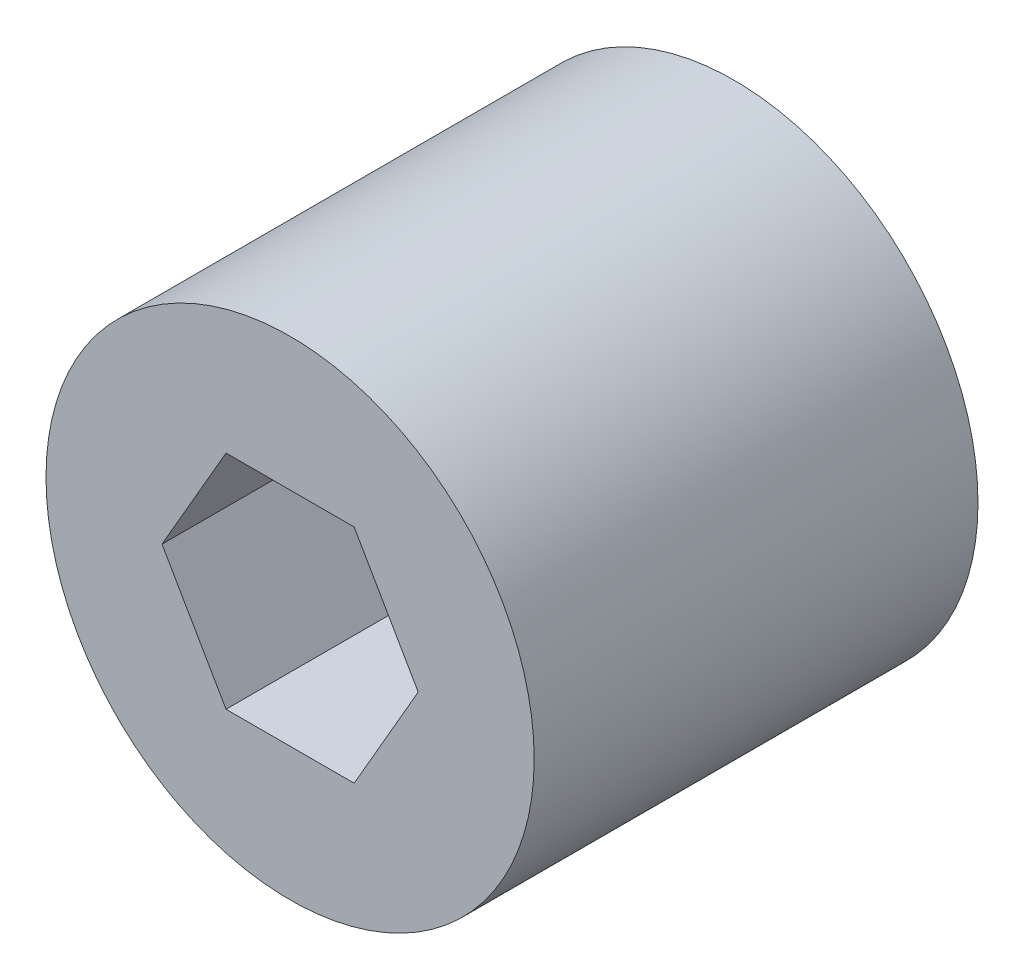
ISO-10303-21;
HEADER;
FILE_DESCRIPTION(('STEP AP214'),'2;1');
FILE_NAME('part.step','',(''),(''),'','','');
FILE_SCHEMA(('AUTOMOTIVE_DESIGN { 1 0 10303 214 1 1 1 1 }'));
ENDSEC;
DATA;
#1=APPLICATION_CONTEXT('core data for automotive mechanical design processes');
#2=APPLICATION_PROTOCOL_DEFINITION('international standard','automotive_design',2000,#1);
#3=PRODUCT_CONTEXT('',#1,'mechanical');
#4=PRODUCT('Part','Part','',(#3));
#5=PRODUCT_RELATED_PRODUCT_CATEGORY('part','',(#4));
#6=PRODUCT_DEFINITION_FORMATION('','',#4);
#7=PRODUCT_DEFINITION_CONTEXT('part definition',#1,'design');
#8=PRODUCT_DEFINITION('design','',#6,#7);
#9=PRODUCT_DEFINITION_SHAPE('','',#8);
#10=(LENGTH_UNIT() NAMED_UNIT(*) SI_UNIT(.MILLI.,.METRE.));
#11=(NAMED_UNIT(*) PLANE_ANGLE_UNIT() SI_UNIT($,.RADIAN.));
#12=(NAMED_UNIT(*) SI_UNIT($,.STERADIAN.) SOLID_ANGLE_UNIT());
#13=UNCERTAINTY_MEASURE_WITH_UNIT(LENGTH_MEASURE(1.E-05),#10,'distance_accuracy_value','');
#14=(GEOMETRIC_REPRESENTATION_CONTEXT(3) GLOBAL_UNCERTAINTY_ASSIGNED_CONTEXT((#13)) GLOBAL_UNIT_ASSIGNED_CONTEXT((#10,
#11,#12)) REPRESENTATION_CONTEXT('',''));
#15=CARTESIAN_POINT('',(0.,0.,0.));
#16=DIRECTION('',(0.,0.,1.));
#17=DIRECTION('',(1.,0.,0.));
#18=AXIS2_PLACEMENT_3D('',#15,#16,#17);
#19=CARTESIAN_POINT('',(0.,0.,-25.4));
#20=DIRECTION('',(0.,0.,1.));
#21=DIRECTION('',(1.,0.,0.));
#22=AXIS2_PLACEMENT_3D('',#19,#20,#21);
#23=CYLINDRICAL_SURFACE('',#22,13.97);
#24=CARTESIAN_POINT('',(0.,0.,-25.4));
#25=DIRECTION('',(0.,0.,1.));
#26=DIRECTION('',(1.,0.,0.));
#27=AXIS2_PLACEMENT_3D('',#24,#25,#26);
#28=CIRCLE('',#27,13.97);
#29=CARTESIAN_POINT('',(13.97,0.,-25.4));
#30=VERTEX_POINT('',#29);
#31=EDGE_CURVE('E11',#30,#30,#28,.T.);
#32=ORIENTED_EDGE('',*,*,#31,.T.);
#33=EDGE_LOOP('',(#32));
#34=FACE_BOUND('',#33,.T.);
#35=CARTESIAN_POINT('',(0.,0.,0.));
#36=DIRECTION('',(0.,0.,1.));
#37=DIRECTION('',(1.,0.,0.));
#38=AXIS2_PLACEMENT_3D('',#35,#36,#37);
#39=CIRCLE('',#38,13.97);
#40=CARTESIAN_POINT('',(13.97,0.,0.));
#41=VERTEX_POINT('',#40);
#42=EDGE_CURVE('E42',#41,#41,#39,.T.);
#43=ORIENTED_EDGE('',*,*,#42,.F.);
#44=EDGE_LOOP('',(#43));
#45=FACE_BOUND('',#44,.T.);
#46=ADVANCED_FACE('F39',(#34,#45),#23,.T.);
#47=CARTESIAN_POINT('',(0.,0.,-25.4));
#48=DIRECTION('',(0.,0.,1.));
#49=DIRECTION('',(1.,0.,0.));
#50=AXIS2_PLACEMENT_3D('',#47,#48,#49);
#51=PLANE('',#50);
#52=DIRECTION('',(-0.5,0.866025403784438,0.));
#53=VECTOR('',#52,1.);
#54=CARTESIAN_POINT('',(7.33234841870825,0.,-25.4));
#55=LINE('',#54,#53);
#56=CARTESIAN_POINT('',(7.33234841870825,0.,-25.4));
#57=VERTEX_POINT('',#56);
#58=CARTESIAN_POINT('',(3.66617420935412,6.35,-25.4));
#59=VERTEX_POINT('',#58);
#60=EDGE_CURVE('E101',#57,#59,#55,.T.);
#61=ORIENTED_EDGE('',*,*,#60,.T.);
#62=DIRECTION('',(-1.,0.,0.));
#63=VECTOR('',#62,1.);
#64=CARTESIAN_POINT('',(3.66617420935412,6.35,-25.4));
#65=LINE('',#64,#63);
#66=CARTESIAN_POINT('',(-3.66617420935413,6.35,-25.4));
#67=VERTEX_POINT('',#66);
#68=EDGE_CURVE('E94',#59,#67,#65,.T.);
#69=ORIENTED_EDGE('',*,*,#68,.T.);
#70=DIRECTION('',(-0.5,-0.866025403784439,0.));
#71=VECTOR('',#70,1.);
#72=CARTESIAN_POINT('',(-3.66617420935413,6.35,-25.4));
#73=LINE('',#72,#71);
#74=CARTESIAN_POINT('',(-7.33234841870825,0.,-25.4));
#75=VERTEX_POINT('',#74);
#76=EDGE_CURVE('E104',#67,#75,#73,.T.);
#77=ORIENTED_EDGE('',*,*,#76,.T.);
#78=DIRECTION('',(0.5,-0.866025403784438,0.));
#79=VECTOR('',#78,1.);
#80=CARTESIAN_POINT('',(-7.33234841870825,0.,-25.4));
#81=LINE('',#80,#79);
#82=CARTESIAN_POINT('',(-3.66617420935412,-6.35,-25.4));
#83=VERTEX_POINT('',#82);
#84=EDGE_CURVE('E54',#75,#83,#81,.T.);
#85=ORIENTED_EDGE('',*,*,#84,.T.);
#86=DIRECTION('',(1.,0.,0.));
#87=VECTOR('',#86,1.);
#88=CARTESIAN_POINT('',(-3.66617420935412,-6.35,-25.4));
#89=LINE('',#88,#87);
#90=CARTESIAN_POINT('',(3.66617420935413,-6.35,-25.4));
#91=VERTEX_POINT('',#90);
#92=EDGE_CURVE('E123',#83,#91,#89,.T.);
#93=ORIENTED_EDGE('',*,*,#92,.T.);
#94=DIRECTION('',(0.5,0.866025403784439,0.));
#95=VECTOR('',#94,1.);
#96=CARTESIAN_POINT('',(3.66617420935413,-6.35,-25.4));
#97=LINE('',#96,#95);
#98=EDGE_CURVE('E127',#91,#57,#97,.T.);
#99=ORIENTED_EDGE('',*,*,#98,.T.);
#100=EDGE_LOOP('',(#61,#69,#77,#85,#93,#99));
#101=FACE_BOUND('',#100,.T.);
#102=ORIENTED_EDGE('',*,*,#31,.F.);
#103=EDGE_LOOP('',(#102));
#104=FACE_BOUND('',#103,.T.);
#105=ADVANCED_FACE('F109',(#101,#104),#51,.F.);
#106=CARTESIAN_POINT('',(0.,0.,0.));
#107=DIRECTION('',(0.,0.,1.));
#108=DIRECTION('',(1.,0.,0.));
#109=AXIS2_PLACEMENT_3D('',#106,#107,#108);
#110=PLANE('',#109);
#111=DIRECTION('',(-1.,0.,0.));
#112=VECTOR('',#111,1.);
#113=CARTESIAN_POINT('',(3.66617420935412,6.35,0.));
#114=LINE('',#113,#112);
#115=CARTESIAN_POINT('',(3.66617420935412,6.35,0.));
#116=VERTEX_POINT('',#115);
#117=CARTESIAN_POINT('',(-3.66617420935413,6.35,0.));
#118=VERTEX_POINT('',#117);
#119=EDGE_CURVE('E62',#116,#118,#114,.T.);
#120=ORIENTED_EDGE('',*,*,#119,.F.);
#121=DIRECTION('',(-0.5,0.866025403784438,0.));
#122=VECTOR('',#121,1.);
#123=CARTESIAN_POINT('',(7.33234841870825,0.,0.));
#124=LINE('',#123,#122);
#125=CARTESIAN_POINT('',(7.33234841870825,0.,0.));
#126=VERTEX_POINT('',#125);
#127=EDGE_CURVE('E114',#126,#116,#124,.T.);
#128=ORIENTED_EDGE('',*,*,#127,.F.);
#129=DIRECTION('',(0.5,0.866025403784439,0.));
#130=VECTOR('',#129,1.);
#131=CARTESIAN_POINT('',(3.66617420935413,-6.35,0.));
#132=LINE('',#131,#130);
#133=CARTESIAN_POINT('',(3.66617420935413,-6.35,0.));
#134=VERTEX_POINT('',#133);
#135=EDGE_CURVE('E118',#134,#126,#132,.T.);
#136=ORIENTED_EDGE('',*,*,#135,.F.);
#137=DIRECTION('',(1.,0.,0.));
#138=VECTOR('',#137,1.);
#139=CARTESIAN_POINT('',(-3.66617420935412,-6.35,0.));
#140=LINE('',#139,#138);
#141=CARTESIAN_POINT('',(-3.66617420935412,-6.35,0.));
#142=VERTEX_POINT('',#141);
#143=EDGE_CURVE('E141',#142,#134,#140,.T.);
#144=ORIENTED_EDGE('',*,*,#143,.F.);
#145=DIRECTION('',(0.5,-0.866025403784438,0.));
#146=VECTOR('',#145,1.);
#147=CARTESIAN_POINT('',(-7.33234841870825,0.,0.));
#148=LINE('',#147,#146);
#149=CARTESIAN_POINT('',(-7.33234841870825,0.,0.));
#150=VERTEX_POINT('',#149);
#151=EDGE_CURVE('E137',#150,#142,#148,.T.);
#152=ORIENTED_EDGE('',*,*,#151,.F.);
#153=DIRECTION('',(-0.5,-0.866025403784439,0.));
#154=VECTOR('',#153,1.);
#155=CARTESIAN_POINT('',(-3.66617420935413,6.35,0.));
#156=LINE('',#155,#154);
#157=EDGE_CURVE('E134',#118,#150,#156,.T.);
#158=ORIENTED_EDGE('',*,*,#157,.F.);
#159=EDGE_LOOP('',(#120,#128,#136,#144,#152,#158));
#160=FACE_BOUND('',#159,.T.);
#161=ORIENTED_EDGE('',*,*,#42,.T.);
#162=EDGE_LOOP('',(#161));
#163=FACE_BOUND('',#162,.T.);
#164=ADVANCED_FACE('F165',(#160,#163),#110,.T.);
#165=CARTESIAN_POINT('',(3.66617420935412,6.35,-25.4));
#166=DIRECTION('',(0.,1.,0.));
#167=DIRECTION('',(-1.,0.,0.));
#168=AXIS2_PLACEMENT_3D('',#165,#166,#167);
#169=PLANE('',#168);
#170=ORIENTED_EDGE('',*,*,#119,.T.);
#171=DIRECTION('',(0.,0.,1.));
#172=VECTOR('',#171,1.);
#173=CARTESIAN_POINT('',(-3.66617420935413,6.35,-25.4));
#174=LINE('',#173,#172);
#175=EDGE_CURVE('E90',#67,#118,#174,.T.);
#176=ORIENTED_EDGE('',*,*,#175,.F.);
#177=ORIENTED_EDGE('',*,*,#68,.F.);
#178=DIRECTION('',(0.,0.,1.));
#179=VECTOR('',#178,1.);
#180=CARTESIAN_POINT('',(3.66617420935412,6.35,-25.4));
#181=LINE('',#180,#179);
#182=EDGE_CURVE('E148',#59,#116,#181,.T.);
#183=ORIENTED_EDGE('',*,*,#182,.T.);
#184=EDGE_LOOP('',(#170,#176,#177,#183));
#185=FACE_BOUND('',#184,.T.);
#186=ADVANCED_FACE('F92',(#185),#169,.F.);
#187=CARTESIAN_POINT('',(7.33234841870825,0.,-25.4));
#188=DIRECTION('',(0.866025403784438,0.5,0.));
#189=DIRECTION('',(-0.5,0.866025403784439,0.));
#190=AXIS2_PLACEMENT_3D('',#187,#188,#189);
#191=PLANE('',#190);
#192=ORIENTED_EDGE('',*,*,#127,.T.);
#193=ORIENTED_EDGE('',*,*,#182,.F.);
#194=ORIENTED_EDGE('',*,*,#60,.F.);
#195=DIRECTION('',(0.,0.,1.));
#196=VECTOR('',#195,1.);
#197=CARTESIAN_POINT('',(7.33234841870825,0.,-25.4));
#198=LINE('',#197,#196);
#199=EDGE_CURVE('E151',#57,#126,#198,.T.);
#200=ORIENTED_EDGE('',*,*,#199,.T.);
#201=EDGE_LOOP('',(#192,#193,#194,#200));
#202=FACE_BOUND('',#201,.T.);
#203=ADVANCED_FACE('F176',(#202),#191,.F.);
#204=CARTESIAN_POINT('',(3.66617420935413,-6.35,-25.4));
#205=DIRECTION('',(0.866025403784439,-0.5,0.));
#206=DIRECTION('',(0.5,0.866025403784439,0.));
#207=AXIS2_PLACEMENT_3D('',#204,#205,#206);
#208=PLANE('',#207);
#209=ORIENTED_EDGE('',*,*,#135,.T.);
#210=ORIENTED_EDGE('',*,*,#199,.F.);
#211=ORIENTED_EDGE('',*,*,#98,.F.);
#212=DIRECTION('',(0.,0.,1.));
#213=VECTOR('',#212,1.);
#214=CARTESIAN_POINT('',(3.66617420935413,-6.35,-25.4));
#215=LINE('',#214,#213);
#216=EDGE_CURVE('E154',#91,#134,#215,.T.);
#217=ORIENTED_EDGE('',*,*,#216,.T.);
#218=EDGE_LOOP('',(#209,#210,#211,#217));
#219=FACE_BOUND('',#218,.T.);
#220=ADVANCED_FACE('F174',(#219),#208,.F.);
#221=CARTESIAN_POINT('',(-3.66617420935412,-6.35,-25.4));
#222=DIRECTION('',(0.,-1.,0.));
#223=DIRECTION('',(1.,0.,0.));
#224=AXIS2_PLACEMENT_3D('',#221,#222,#223);
#225=PLANE('',#224);
#226=ORIENTED_EDGE('',*,*,#143,.T.);
#227=ORIENTED_EDGE('',*,*,#216,.F.);
#228=ORIENTED_EDGE('',*,*,#92,.F.);
#229=DIRECTION('',(0.,0.,1.));
#230=VECTOR('',#229,1.);
#231=CARTESIAN_POINT('',(-3.66617420935412,-6.35,-25.4));
#232=LINE('',#231,#230);
#233=EDGE_CURVE('E157',#83,#142,#232,.T.);
#234=ORIENTED_EDGE('',*,*,#233,.T.);
#235=EDGE_LOOP('',(#226,#227,#228,#234));
#236=FACE_BOUND('',#235,.T.);
#237=ADVANCED_FACE('F170',(#236),#225,.F.);
#238=CARTESIAN_POINT('',(-7.33234841870825,0.,-25.4));
#239=DIRECTION('',(-0.866025403784438,-0.5,0.));
#240=DIRECTION('',(0.5,-0.866025403784438,0.));
#241=AXIS2_PLACEMENT_3D('',#238,#239,#240);
#242=PLANE('',#241);
#243=ORIENTED_EDGE('',*,*,#151,.T.);
#244=ORIENTED_EDGE('',*,*,#233,.F.);
#245=ORIENTED_EDGE('',*,*,#84,.F.);
#246=DIRECTION('',(0.,0.,1.));
#247=VECTOR('',#246,1.);
#248=CARTESIAN_POINT('',(-7.33234841870825,0.,-25.4));
#249=LINE('',#248,#247);
#250=EDGE_CURVE('E100',#75,#150,#249,.T.);
#251=ORIENTED_EDGE('',*,*,#250,.T.);
#252=EDGE_LOOP('',(#243,#244,#245,#251));
#253=FACE_BOUND('',#252,.T.);
#254=ADVANCED_FACE('F161',(#253),#242,.F.);
#255=CARTESIAN_POINT('',(-3.66617420935413,6.35,-25.4));
#256=DIRECTION('',(-0.866025403784439,0.5,0.));
#257=DIRECTION('',(-0.5,-0.866025403784439,0.));
#258=AXIS2_PLACEMENT_3D('',#255,#256,#257);
#259=PLANE('',#258);
#260=ORIENTED_EDGE('',*,*,#157,.T.);
#261=ORIENTED_EDGE('',*,*,#250,.F.);
#262=ORIENTED_EDGE('',*,*,#76,.F.);
#263=ORIENTED_EDGE('',*,*,#175,.T.);
#264=EDGE_LOOP('',(#260,#261,#262,#263));
#265=FACE_BOUND('',#264,.T.);
#266=ADVANCED_FACE('F105',(#265),#259,.F.);
#267=CLOSED_SHELL('',(#46,#105,#164,#186,#203,#220,#237,#254,#266));
#268=MANIFOLD_SOLID_BREP('B2',#267);
#269=ADVANCED_BREP_SHAPE_REPRESENTATION('',(#18,#268),#14);
#270=SHAPE_DEFINITION_REPRESENTATION(#9,#269);
ENDSEC;
END-ISO-10303-21;
